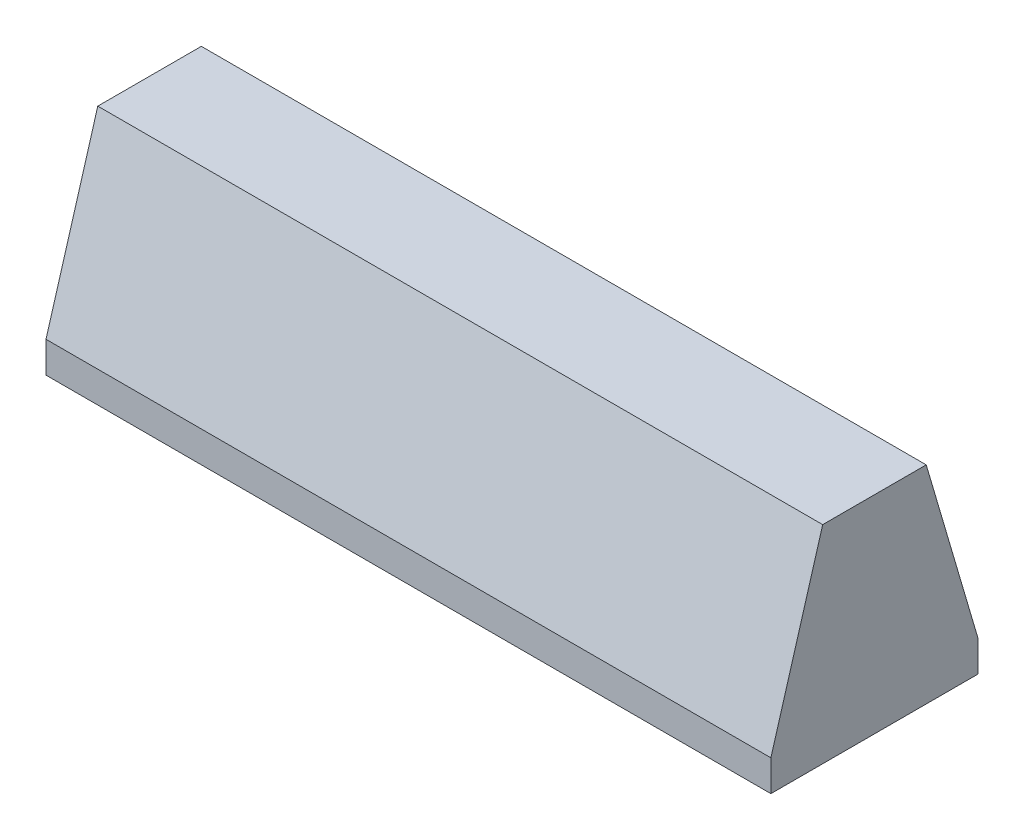
ISO-10303-21;
HEADER;
FILE_DESCRIPTION(('STEP AP214'),'2;1');
FILE_NAME('part.step','',(''),(''),'','','');
FILE_SCHEMA(('AUTOMOTIVE_DESIGN { 1 0 10303 214 1 1 1 1 }'));
ENDSEC;
DATA;
#1=APPLICATION_CONTEXT('core data for automotive mechanical design processes');
#2=APPLICATION_PROTOCOL_DEFINITION('international standard','automotive_design',2000,#1);
#3=PRODUCT_CONTEXT('',#1,'mechanical');
#4=PRODUCT('Part','Part','',(#3));
#5=PRODUCT_RELATED_PRODUCT_CATEGORY('part','',(#4));
#6=PRODUCT_DEFINITION_FORMATION('','',#4);
#7=PRODUCT_DEFINITION_CONTEXT('part definition',#1,'design');
#8=PRODUCT_DEFINITION('design','',#6,#7);
#9=PRODUCT_DEFINITION_SHAPE('','',#8);
#10=(LENGTH_UNIT() NAMED_UNIT(*) SI_UNIT(.MILLI.,.METRE.));
#11=(NAMED_UNIT(*) PLANE_ANGLE_UNIT() SI_UNIT($,.RADIAN.));
#12=(NAMED_UNIT(*) SI_UNIT($,.STERADIAN.) SOLID_ANGLE_UNIT());
#13=UNCERTAINTY_MEASURE_WITH_UNIT(LENGTH_MEASURE(1.E-05),#10,'distance_accuracy_value','');
#14=(GEOMETRIC_REPRESENTATION_CONTEXT(3) GLOBAL_UNCERTAINTY_ASSIGNED_CONTEXT((#13)) GLOBAL_UNIT_ASSIGNED_CONTEXT((#10,
#11,#12)) REPRESENTATION_CONTEXT('',''));
#15=CARTESIAN_POINT('',(0.,0.,0.));
#16=DIRECTION('',(0.,0.,1.));
#17=DIRECTION('',(1.,0.,0.));
#18=AXIS2_PLACEMENT_3D('',#15,#16,#17);
#19=CARTESIAN_POINT('',(0.,20.,0.));
#20=DIRECTION('',(1.,0.,0.));
#21=DIRECTION('',(0.,0.,-1.));
#22=AXIS2_PLACEMENT_3D('',#19,#20,#21);
#23=PLANE('',#22);
#24=DIRECTION('',(0.,0.,1.));
#25=VECTOR('',#24,1.);
#26=CARTESIAN_POINT('',(0.,20.,0.));
#27=LINE('',#26,#25);
#28=CARTESIAN_POINT('',(0.,20.,-15.));
#29=VERTEX_POINT('',#28);
#30=CARTESIAN_POINT('',(0.,20.,-5.));
#31=VERTEX_POINT('',#30);
#32=EDGE_CURVE('E136',#29,#31,#27,.T.);
#33=ORIENTED_EDGE('',*,*,#32,.F.);
#34=DIRECTION('',(0.,0.959365501571271,0.282166323991548));
#35=VECTOR('',#34,1.);
#36=CARTESIAN_POINT('',(0.,20.,-15.));
#37=LINE('',#36,#35);
#38=CARTESIAN_POINT('',(0.,2.99999999999979,-20.));
#39=VERTEX_POINT('',#38);
#40=EDGE_CURVE('E154',#29,#39,#37,.F.);
#41=ORIENTED_EDGE('',*,*,#40,.T.);
#42=DIRECTION('',(0.,-1.,0.));
#43=VECTOR('',#42,1.);
#44=CARTESIAN_POINT('',(0.,20.,-20.));
#45=LINE('',#44,#43);
#46=CARTESIAN_POINT('',(0.,0.,-20.));
#47=VERTEX_POINT('',#46);
#48=EDGE_CURVE('E123',#39,#47,#45,.T.);
#49=ORIENTED_EDGE('',*,*,#48,.T.);
#50=DIRECTION('',(0.,0.,1.));
#51=VECTOR('',#50,1.);
#52=CARTESIAN_POINT('',(0.,0.,0.));
#53=LINE('',#52,#51);
#54=CARTESIAN_POINT('',(0.,0.,0.));
#55=VERTEX_POINT('',#54);
#56=EDGE_CURVE('E117',#47,#55,#53,.T.);
#57=ORIENTED_EDGE('',*,*,#56,.T.);
#58=DIRECTION('',(0.,-1.,0.));
#59=VECTOR('',#58,1.);
#60=CARTESIAN_POINT('',(0.,20.,0.));
#61=LINE('',#60,#59);
#62=CARTESIAN_POINT('',(0.,2.99999999999979,0.));
#63=VERTEX_POINT('',#62);
#64=EDGE_CURVE('E100',#63,#55,#61,.T.);
#65=ORIENTED_EDGE('',*,*,#64,.F.);
#66=DIRECTION('',(0.,-0.959365501571272,0.282166323991547));
#67=VECTOR('',#66,1.);
#68=CARTESIAN_POINT('',(0.,20.,-5.));
#69=LINE('',#68,#67);
#70=EDGE_CURVE('E151',#63,#31,#69,.F.);
#71=ORIENTED_EDGE('',*,*,#70,.T.);
#72=EDGE_LOOP('',(#33,#41,#49,#57,#65,#71));
#73=FACE_BOUND('',#72,.T.);
#74=ADVANCED_FACE('F45',(#73),#23,.F.);
#75=CARTESIAN_POINT('',(0.,20.,0.));
#76=DIRECTION('',(0.,0.,-1.));
#77=DIRECTION('',(-1.,0.,0.));
#78=AXIS2_PLACEMENT_3D('',#75,#76,#77);
#79=PLANE('',#78);
#80=DIRECTION('',(0.,-1.,0.));
#81=VECTOR('',#80,1.);
#82=CARTESIAN_POINT('',(70.,20.,0.));
#83=LINE('',#82,#81);
#84=CARTESIAN_POINT('',(70.,2.99999999999979,0.));
#85=VERTEX_POINT('',#84);
#86=CARTESIAN_POINT('',(70.,0.,0.));
#87=VERTEX_POINT('',#86);
#88=EDGE_CURVE('E111',#85,#87,#83,.T.);
#89=ORIENTED_EDGE('',*,*,#88,.F.);
#90=DIRECTION('',(-1.,0.,0.));
#91=VECTOR('',#90,1.);
#92=CARTESIAN_POINT('',(0.,2.99999999999979,0.));
#93=LINE('',#92,#91);
#94=EDGE_CURVE('E11',#85,#63,#93,.T.);
#95=ORIENTED_EDGE('',*,*,#94,.T.);
#96=ORIENTED_EDGE('',*,*,#64,.T.);
#97=DIRECTION('',(1.,0.,0.));
#98=VECTOR('',#97,1.);
#99=CARTESIAN_POINT('',(0.,0.,0.));
#100=LINE('',#99,#98);
#101=EDGE_CURVE('E103',#55,#87,#100,.T.);
#102=ORIENTED_EDGE('',*,*,#101,.T.);
#103=EDGE_LOOP('',(#89,#95,#96,#102));
#104=FACE_BOUND('',#103,.T.);
#105=ADVANCED_FACE('F102',(#104),#79,.F.);
#106=CARTESIAN_POINT('',(70.,20.,0.));
#107=DIRECTION('',(-1.,0.,0.));
#108=DIRECTION('',(0.,0.,1.));
#109=AXIS2_PLACEMENT_3D('',#106,#107,#108);
#110=PLANE('',#109);
#111=DIRECTION('',(0.,-1.,0.));
#112=VECTOR('',#111,1.);
#113=CARTESIAN_POINT('',(70.,20.,-20.));
#114=LINE('',#113,#112);
#115=CARTESIAN_POINT('',(70.,2.99999999999979,-20.));
#116=VERTEX_POINT('',#115);
#117=CARTESIAN_POINT('',(70.,0.,-20.));
#118=VERTEX_POINT('',#117);
#119=EDGE_CURVE('E139',#116,#118,#114,.T.);
#120=ORIENTED_EDGE('',*,*,#119,.F.);
#121=DIRECTION('',(0.,-0.959365501571271,-0.282166323991548));
#122=VECTOR('',#121,1.);
#123=CARTESIAN_POINT('',(70.,20.,-15.));
#124=LINE('',#123,#122);
#125=CARTESIAN_POINT('',(70.,20.,-15.));
#126=VERTEX_POINT('',#125);
#127=EDGE_CURVE('E55',#116,#126,#124,.F.);
#128=ORIENTED_EDGE('',*,*,#127,.T.);
#129=DIRECTION('',(0.,0.,-1.));
#130=VECTOR('',#129,1.);
#131=CARTESIAN_POINT('',(70.,20.,0.));
#132=LINE('',#131,#130);
#133=CARTESIAN_POINT('',(70.,20.,-5.));
#134=VERTEX_POINT('',#133);
#135=EDGE_CURVE('E128',#134,#126,#132,.T.);
#136=ORIENTED_EDGE('',*,*,#135,.F.);
#137=DIRECTION('',(0.,0.959365501571272,-0.282166323991547));
#138=VECTOR('',#137,1.);
#139=CARTESIAN_POINT('',(70.,20.,-5.));
#140=LINE('',#139,#138);
#141=EDGE_CURVE('E62',#134,#85,#140,.F.);
#142=ORIENTED_EDGE('',*,*,#141,.T.);
#143=ORIENTED_EDGE('',*,*,#88,.T.);
#144=DIRECTION('',(0.,0.,-1.));
#145=VECTOR('',#144,1.);
#146=CARTESIAN_POINT('',(70.,0.,0.));
#147=LINE('',#146,#145);
#148=EDGE_CURVE('E119',#87,#118,#147,.T.);
#149=ORIENTED_EDGE('',*,*,#148,.T.);
#150=EDGE_LOOP('',(#120,#128,#136,#142,#143,#149));
#151=FACE_BOUND('',#150,.T.);
#152=ADVANCED_FACE('F163',(#151),#110,.F.);
#153=CARTESIAN_POINT('',(0.,20.,-20.));
#154=DIRECTION('',(0.,0.,1.));
#155=DIRECTION('',(1.,0.,0.));
#156=AXIS2_PLACEMENT_3D('',#153,#154,#155);
#157=PLANE('',#156);
#158=ORIENTED_EDGE('',*,*,#48,.F.);
#159=DIRECTION('',(1.,0.,0.));
#160=VECTOR('',#159,1.);
#161=CARTESIAN_POINT('',(0.,2.99999999999979,-20.));
#162=LINE('',#161,#160);
#163=EDGE_CURVE('E70',#39,#116,#162,.T.);
#164=ORIENTED_EDGE('',*,*,#163,.T.);
#165=ORIENTED_EDGE('',*,*,#119,.T.);
#166=DIRECTION('',(-1.,0.,0.));
#167=VECTOR('',#166,1.);
#168=CARTESIAN_POINT('',(0.,0.,-20.));
#169=LINE('',#168,#167);
#170=EDGE_CURVE('E133',#118,#47,#169,.T.);
#171=ORIENTED_EDGE('',*,*,#170,.T.);
#172=EDGE_LOOP('',(#158,#164,#165,#171));
#173=FACE_BOUND('',#172,.T.);
#174=ADVANCED_FACE('F172',(#173),#157,.F.);
#175=CARTESIAN_POINT('',(0.,20.,0.));
#176=DIRECTION('',(0.,-1.,0.));
#177=DIRECTION('',(0.,0.,-1.));
#178=AXIS2_PLACEMENT_3D('',#175,#176,#177);
#179=PLANE('',#178);
#180=ORIENTED_EDGE('',*,*,#135,.T.);
#181=DIRECTION('',(-1.,0.,0.));
#182=VECTOR('',#181,1.);
#183=CARTESIAN_POINT('',(0.,20.,-15.));
#184=LINE('',#183,#182);
#185=EDGE_CURVE('E147',#126,#29,#184,.T.);
#186=ORIENTED_EDGE('',*,*,#185,.T.);
#187=ORIENTED_EDGE('',*,*,#32,.T.);
#188=DIRECTION('',(1.,0.,0.));
#189=VECTOR('',#188,1.);
#190=CARTESIAN_POINT('',(0.,20.,-5.));
#191=LINE('',#190,#189);
#192=EDGE_CURVE('E110',#31,#134,#191,.T.);
#193=ORIENTED_EDGE('',*,*,#192,.T.);
#194=EDGE_LOOP('',(#180,#186,#187,#193));
#195=FACE_BOUND('',#194,.T.);
#196=ADVANCED_FACE('F167',(#195),#179,.F.);
#197=CARTESIAN_POINT('',(0.,0.,0.));
#198=DIRECTION('',(0.,-1.,0.));
#199=DIRECTION('',(0.,0.,-1.));
#200=AXIS2_PLACEMENT_3D('',#197,#198,#199);
#201=PLANE('',#200);
#202=ORIENTED_EDGE('',*,*,#56,.F.);
#203=ORIENTED_EDGE('',*,*,#170,.F.);
#204=ORIENTED_EDGE('',*,*,#148,.F.);
#205=ORIENTED_EDGE('',*,*,#101,.F.);
#206=EDGE_LOOP('',(#202,#203,#204,#205));
#207=FACE_BOUND('',#206,.T.);
#208=ADVANCED_FACE('F115',(#207),#201,.T.);
#209=CARTESIAN_POINT('',(0.,20.,-15.));
#210=DIRECTION('',(0.,-0.282166323991548,0.959365501571271));
#211=DIRECTION('',(-1.,0.,0.));
#212=AXIS2_PLACEMENT_3D('',#209,#210,#211);
#213=PLANE('',#212);
#214=ORIENTED_EDGE('',*,*,#127,.F.);
#215=ORIENTED_EDGE('',*,*,#163,.F.);
#216=ORIENTED_EDGE('',*,*,#40,.F.);
#217=ORIENTED_EDGE('',*,*,#185,.F.);
#218=EDGE_LOOP('',(#214,#215,#216,#217));
#219=FACE_BOUND('',#218,.T.);
#220=ADVANCED_FACE('F171',(#219),#213,.F.);
#221=CARTESIAN_POINT('',(0.,20.,-5.));
#222=DIRECTION('',(0.,-0.282166323991547,-0.959365501571271));
#223=DIRECTION('',(1.,0.,0.));
#224=AXIS2_PLACEMENT_3D('',#221,#222,#223);
#225=PLANE('',#224);
#226=ORIENTED_EDGE('',*,*,#70,.F.);
#227=ORIENTED_EDGE('',*,*,#94,.F.);
#228=ORIENTED_EDGE('',*,*,#141,.F.);
#229=ORIENTED_EDGE('',*,*,#192,.F.);
#230=EDGE_LOOP('',(#226,#227,#228,#229));
#231=FACE_BOUND('',#230,.T.);
#232=ADVANCED_FACE('F48',(#231),#225,.F.);
#233=CLOSED_SHELL('',(#74,#105,#152,#174,#196,#208,#220,#232));
#234=MANIFOLD_SOLID_BREP('B2',#233);
#235=ADVANCED_BREP_SHAPE_REPRESENTATION('',(#18,#234),#14);
#236=SHAPE_DEFINITION_REPRESENTATION(#9,#235);
ENDSEC;
END-ISO-10303-21;
